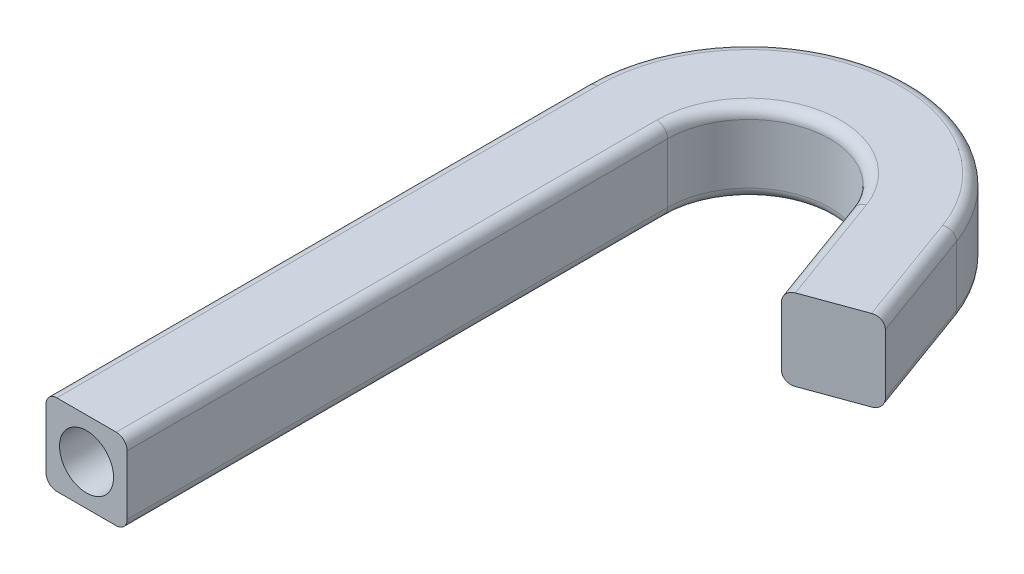
ISO-10303-21;
HEADER;
FILE_DESCRIPTION(('STEP AP214'),'2;1');
FILE_NAME('part.step','',(''),(''),'','','');
FILE_SCHEMA(('AUTOMOTIVE_DESIGN { 1 0 10303 214 1 1 1 1 }'));
ENDSEC;
DATA;
#1=APPLICATION_CONTEXT('core data for automotive mechanical design processes');
#2=APPLICATION_PROTOCOL_DEFINITION('international standard','automotive_design',2000,#1);
#3=PRODUCT_CONTEXT('',#1,'mechanical');
#4=PRODUCT('Part','Part','',(#3));
#5=PRODUCT_RELATED_PRODUCT_CATEGORY('part','',(#4));
#6=PRODUCT_DEFINITION_FORMATION('','',#4);
#7=PRODUCT_DEFINITION_CONTEXT('part definition',#1,'design');
#8=PRODUCT_DEFINITION('design','',#6,#7);
#9=PRODUCT_DEFINITION_SHAPE('','',#8);
#10=(LENGTH_UNIT() NAMED_UNIT(*) SI_UNIT(.MILLI.,.METRE.));
#11=(NAMED_UNIT(*) PLANE_ANGLE_UNIT() SI_UNIT($,.RADIAN.));
#12=(NAMED_UNIT(*) SI_UNIT($,.STERADIAN.) SOLID_ANGLE_UNIT());
#13=UNCERTAINTY_MEASURE_WITH_UNIT(LENGTH_MEASURE(1.E-05),#10,'distance_accuracy_value','');
#14=(GEOMETRIC_REPRESENTATION_CONTEXT(3) GLOBAL_UNCERTAINTY_ASSIGNED_CONTEXT((#13)) GLOBAL_UNIT_ASSIGNED_CONTEXT((#10,
#11,#12)) REPRESENTATION_CONTEXT('',''));
#15=CARTESIAN_POINT('',(0.,0.,0.));
#16=DIRECTION('',(0.,0.,1.));
#17=DIRECTION('',(1.,0.,0.));
#18=AXIS2_PLACEMENT_3D('',#15,#16,#17);
#19=CARTESIAN_POINT('',(17.9011444259716,19.05,-6.515483730354));
#20=DIRECTION('',(0.939692620785908,0.,-0.342020143325669));
#21=DIRECTION('',(-0.342020143325669,0.,-0.939692620785908));
#22=AXIS2_PLACEMENT_3D('',#19,#20,#21);
#23=PLANE('',#22);
#24=DIRECTION('',(0.,-1.,0.));
#25=VECTOR('',#24,1.);
#26=CARTESIAN_POINT('',(27.4622856022967,19.05,19.753535755817));
#27=LINE('',#26,#25);
#28=CARTESIAN_POINT('',(27.4622856022967,16.51,19.753535755817));
#29=VERTEX_POINT('',#28);
#30=CARTESIAN_POINT('',(27.4622856022967,2.54000000000001,19.753535755817));
#31=VERTEX_POINT('',#30);
#32=EDGE_CURVE('E208',#29,#31,#27,.T.);
#33=ORIENTED_EDGE('',*,*,#32,.F.);
#34=DIRECTION('',(0.342020143325669,0.,0.939692620785908));
#35=VECTOR('',#34,1.);
#36=CARTESIAN_POINT('',(17.9011444259716,16.51,-6.515483730354));
#37=LINE('',#36,#35);
#38=CARTESIAN_POINT('',(17.9011444259716,16.51,-6.515483730354));
#39=VERTEX_POINT('',#38);
#40=EDGE_CURVE('E152',#29,#39,#37,.F.);
#41=ORIENTED_EDGE('',*,*,#40,.T.);
#42=DIRECTION('',(0.,-1.,0.));
#43=VECTOR('',#42,1.);
#44=CARTESIAN_POINT('',(17.9011444259716,19.05,-6.515483730354));
#45=LINE('',#44,#43);
#46=CARTESIAN_POINT('',(17.9011444259716,2.54000000000001,-6.515483730354));
#47=VERTEX_POINT('',#46);
#48=EDGE_CURVE('E178',#39,#47,#45,.T.);
#49=ORIENTED_EDGE('',*,*,#48,.T.);
#50=DIRECTION('',(0.342020143325669,0.,0.939692620785908));
#51=VECTOR('',#50,1.);
#52=CARTESIAN_POINT('',(17.9011444259716,2.54,-6.515483730354));
#53=LINE('',#52,#51);
#54=EDGE_CURVE('E157',#47,#31,#53,.T.);
#55=ORIENTED_EDGE('',*,*,#54,.T.);
#56=EDGE_LOOP('',(#33,#41,#49,#55));
#57=FACE_BOUND('',#56,.T.);
#58=ADVANCED_FACE('F32',(#57),#23,.F.);
#59=CARTESIAN_POINT('',(27.4622856022967,19.05,19.753535755817));
#60=DIRECTION('',(-0.342020143325669,0.,-0.939692620785908));
#61=DIRECTION('',(-0.939692620785908,0.,0.342020143325669));
#62=AXIS2_PLACEMENT_3D('',#59,#60,#61);
#63=PLANE('',#62);
#64=DIRECTION('',(0.939692620785908,0.,-0.342020143325669));
#65=VECTOR('',#64,1.);
#66=CARTESIAN_POINT('',(27.4622856022967,19.05,19.753535755817));
#67=LINE('',#66,#65);
#68=CARTESIAN_POINT('',(29.8491048590929,19.05,18.8848045917698));
#69=VERTEX_POINT('',#68);
#70=CARTESIAN_POINT('',(42.976610771472,19.05,14.1067831895102));
#71=VERTEX_POINT('',#70);
#72=EDGE_CURVE('E164',#69,#71,#67,.T.);
#73=ORIENTED_EDGE('',*,*,#72,.F.);
#74=CARTESIAN_POINT('',(29.8491048590929,16.51,18.8848045917698));
#75=DIRECTION('',(-0.342020143325669,0.,-0.939692620785908));
#76=DIRECTION('',(-0.939692620785908,0.,0.342020143325669));
#77=AXIS2_PLACEMENT_3D('',#74,#75,#76);
#78=CIRCLE('',#77,2.54);
#79=EDGE_CURVE('E147',#69,#29,#78,.F.);
#80=ORIENTED_EDGE('',*,*,#79,.T.);
#81=ORIENTED_EDGE('',*,*,#32,.T.);
#82=CARTESIAN_POINT('',(29.8491048590929,2.54,18.8848045917698));
#83=DIRECTION('',(-0.342020143325669,0.,-0.939692620785908));
#84=DIRECTION('',(-0.939692620785908,0.,0.342020143325669));
#85=AXIS2_PLACEMENT_3D('',#82,#83,#84);
#86=CIRCLE('',#85,2.54);
#87=CARTESIAN_POINT('',(29.8491048590929,0.,18.8848045917698));
#88=VERTEX_POINT('',#87);
#89=EDGE_CURVE('E158',#31,#88,#86,.F.);
#90=ORIENTED_EDGE('',*,*,#89,.T.);
#91=DIRECTION('',(0.939692620785908,0.,-0.342020143325669));
#92=VECTOR('',#91,1.);
#93=CARTESIAN_POINT('',(27.4622856022967,0.,19.753535755817));
#94=LINE('',#93,#92);
#95=CARTESIAN_POINT('',(42.976610771472,0.,14.1067831895102));
#96=VERTEX_POINT('',#95);
#97=EDGE_CURVE('E181',#88,#96,#94,.T.);
#98=ORIENTED_EDGE('',*,*,#97,.T.);
#99=CARTESIAN_POINT('',(42.976610771472,2.54,14.1067831895102));
#100=DIRECTION('',(-0.342020143325669,0.,-0.939692620785908));
#101=DIRECTION('',(-0.939692620785908,0.,0.342020143325669));
#102=AXIS2_PLACEMENT_3D('',#99,#100,#101);
#103=CIRCLE('',#102,2.54);
#104=CARTESIAN_POINT('',(45.3634300282682,2.54000000000001,13.238052025463));
#105=VERTEX_POINT('',#104);
#106=EDGE_CURVE('E220',#96,#105,#103,.F.);
#107=ORIENTED_EDGE('',*,*,#106,.T.);
#108=DIRECTION('',(0.,-1.,0.));
#109=VECTOR('',#108,1.);
#110=CARTESIAN_POINT('',(45.3634300282682,19.05,13.238052025463));
#111=LINE('',#110,#109);
#112=CARTESIAN_POINT('',(45.3634300282682,16.51,13.238052025463));
#113=VERTEX_POINT('',#112);
#114=EDGE_CURVE('E206',#113,#105,#111,.T.);
#115=ORIENTED_EDGE('',*,*,#114,.F.);
#116=CARTESIAN_POINT('',(42.976610771472,16.51,14.1067831895102));
#117=DIRECTION('',(-0.342020143325669,0.,-0.939692620785908));
#118=DIRECTION('',(-0.939692620785908,0.,0.342020143325669));
#119=AXIS2_PLACEMENT_3D('',#116,#117,#118);
#120=CIRCLE('',#119,2.54);
#121=EDGE_CURVE('E169',#113,#71,#120,.F.);
#122=ORIENTED_EDGE('',*,*,#121,.T.);
#123=EDGE_LOOP('',(#73,#80,#81,#90,#98,#107,#115,#122));
#124=FACE_BOUND('',#123,.T.);
#125=ADVANCED_FACE('F171',(#124),#63,.F.);
#126=CARTESIAN_POINT('',(35.8022888519431,19.05,-13.030967460708));
#127=DIRECTION('',(-0.939692620785908,0.,0.342020143325669));
#128=DIRECTION('',(0.342020143325669,0.,0.939692620785908));
#129=AXIS2_PLACEMENT_3D('',#126,#127,#128);
#130=PLANE('',#129);
#131=ORIENTED_EDGE('',*,*,#114,.T.);
#132=DIRECTION('',(-0.342020143325669,0.,-0.939692620785908));
#133=VECTOR('',#132,1.);
#134=CARTESIAN_POINT('',(35.8022888519431,2.54,-13.030967460708));
#135=LINE('',#134,#133);
#136=CARTESIAN_POINT('',(35.8022888519431,2.54000000000001,-13.030967460708));
#137=VERTEX_POINT('',#136);
#138=EDGE_CURVE('E11',#105,#137,#135,.T.);
#139=ORIENTED_EDGE('',*,*,#138,.T.);
#140=DIRECTION('',(0.,-1.,0.));
#141=VECTOR('',#140,1.);
#142=CARTESIAN_POINT('',(35.8022888519431,19.05,-13.030967460708));
#143=LINE('',#142,#141);
#144=CARTESIAN_POINT('',(35.8022888519431,16.51,-13.030967460708));
#145=VERTEX_POINT('',#144);
#146=EDGE_CURVE('E204',#145,#137,#143,.T.);
#147=ORIENTED_EDGE('',*,*,#146,.F.);
#148=DIRECTION('',(-0.342020143325669,0.,-0.939692620785908));
#149=VECTOR('',#148,1.);
#150=CARTESIAN_POINT('',(45.3634300282682,16.51,13.238052025463));
#151=LINE('',#150,#149);
#152=EDGE_CURVE('E41',#145,#113,#151,.F.);
#153=ORIENTED_EDGE('',*,*,#152,.T.);
#154=EDGE_LOOP('',(#131,#139,#147,#153));
#155=FACE_BOUND('',#154,.T.);
#156=ADVANCED_FACE('F350',(#155),#130,.F.);
#157=CARTESIAN_POINT('',(0.,19.05,0.));
#158=DIRECTION('',(0.,-1.,0.));
#159=DIRECTION('',(0.,0.,-1.));
#160=AXIS2_PLACEMENT_3D('',#157,#158,#159);
#161=CYLINDRICAL_SURFACE('',#160,38.1);
#162=ORIENTED_EDGE('',*,*,#146,.T.);
#163=CARTESIAN_POINT('',(0.,2.54,0.));
#164=DIRECTION('',(0.,1.,0.));
#165=DIRECTION('',(0.,0.,1.));
#166=AXIS2_PLACEMENT_3D('',#163,#164,#165);
#167=CIRCLE('',#166,38.1);
#168=CARTESIAN_POINT('',(-38.1,2.54000000000001,0.));
#169=VERTEX_POINT('',#168);
#170=EDGE_CURVE('E260',#137,#169,#167,.T.);
#171=ORIENTED_EDGE('',*,*,#170,.T.);
#172=DIRECTION('',(0.,-1.,0.));
#173=VECTOR('',#172,1.);
#174=CARTESIAN_POINT('',(-38.1,19.05,0.));
#175=LINE('',#174,#173);
#176=CARTESIAN_POINT('',(-38.1,16.51,0.));
#177=VERTEX_POINT('',#176);
#178=EDGE_CURVE('E201',#177,#169,#175,.T.);
#179=ORIENTED_EDGE('',*,*,#178,.F.);
#180=CARTESIAN_POINT('',(0.,16.51,0.));
#181=DIRECTION('',(0.,1.,0.));
#182=DIRECTION('',(0.,0.,1.));
#183=AXIS2_PLACEMENT_3D('',#180,#181,#182);
#184=CIRCLE('',#183,38.1);
#185=EDGE_CURVE('E54',#177,#145,#184,.F.);
#186=ORIENTED_EDGE('',*,*,#185,.T.);
#187=EDGE_LOOP('',(#162,#171,#179,#186));
#188=FACE_BOUND('',#187,.T.);
#189=ADVANCED_FACE('F386',(#188),#161,.T.);
#190=CARTESIAN_POINT('',(-38.1,19.05,0.));
#191=DIRECTION('',(1.,0.,0.));
#192=DIRECTION('',(0.,0.,-1.));
#193=AXIS2_PLACEMENT_3D('',#190,#191,#192);
#194=PLANE('',#193);
#195=ORIENTED_EDGE('',*,*,#178,.T.);
#196=DIRECTION('',(0.,0.,1.));
#197=VECTOR('',#196,1.);
#198=CARTESIAN_POINT('',(-38.1,2.54,0.));
#199=LINE('',#198,#197);
#200=CARTESIAN_POINT('',(-38.1,2.54000000000001,127.));
#201=VERTEX_POINT('',#200);
#202=EDGE_CURVE('E256',#169,#201,#199,.T.);
#203=ORIENTED_EDGE('',*,*,#202,.T.);
#204=DIRECTION('',(0.,-1.,0.));
#205=VECTOR('',#204,1.);
#206=CARTESIAN_POINT('',(-38.1,19.05,127.));
#207=LINE('',#206,#205);
#208=CARTESIAN_POINT('',(-38.1,16.51,127.));
#209=VERTEX_POINT('',#208);
#210=EDGE_CURVE('E198',#209,#201,#207,.T.);
#211=ORIENTED_EDGE('',*,*,#210,.F.);
#212=DIRECTION('',(0.,0.,1.));
#213=VECTOR('',#212,1.);
#214=CARTESIAN_POINT('',(-38.1,16.51,0.));
#215=LINE('',#214,#213);
#216=EDGE_CURVE('E254',#209,#177,#215,.F.);
#217=ORIENTED_EDGE('',*,*,#216,.T.);
#218=EDGE_LOOP('',(#195,#203,#211,#217));
#219=FACE_BOUND('',#218,.T.);
#220=ADVANCED_FACE('F382',(#219),#194,.F.);
#221=CARTESIAN_POINT('',(-38.1,19.05,127.));
#222=DIRECTION('',(0.,0.,-1.));
#223=DIRECTION('',(-1.,0.,0.));
#224=AXIS2_PLACEMENT_3D('',#221,#222,#223);
#225=PLANE('',#224);
#226=CARTESIAN_POINT('',(-28.575,9.525,127.));
#227=DIRECTION('',(0.,0.,1.));
#228=DIRECTION('',(1.,0.,0.));
#229=AXIS2_PLACEMENT_3D('',#226,#227,#228);
#230=CIRCLE('',#229,6.35);
#231=CARTESIAN_POINT('',(-22.225,9.525,127.));
#232=VERTEX_POINT('',#231);
#233=EDGE_CURVE('E184',#232,#232,#230,.T.);
#234=ORIENTED_EDGE('',*,*,#233,.F.);
#235=EDGE_LOOP('',(#234));
#236=FACE_BOUND('',#235,.T.);
#237=DIRECTION('',(1.,0.,0.));
#238=VECTOR('',#237,1.);
#239=CARTESIAN_POINT('',(-38.1,0.,127.));
#240=LINE('',#239,#238);
#241=CARTESIAN_POINT('',(-35.56,0.,127.));
#242=VERTEX_POINT('',#241);
#243=CARTESIAN_POINT('',(-21.59,0.,127.));
#244=VERTEX_POINT('',#243);
#245=EDGE_CURVE('E175',#242,#244,#240,.T.);
#246=ORIENTED_EDGE('',*,*,#245,.T.);
#247=CARTESIAN_POINT('',(-21.59,2.54,127.));
#248=DIRECTION('',(0.,0.,-1.));
#249=DIRECTION('',(-1.,0.,0.));
#250=AXIS2_PLACEMENT_3D('',#247,#248,#249);
#251=CIRCLE('',#250,2.54);
#252=CARTESIAN_POINT('',(-19.05,2.54000000000001,127.));
#253=VERTEX_POINT('',#252);
#254=EDGE_CURVE('E252',#244,#253,#251,.F.);
#255=ORIENTED_EDGE('',*,*,#254,.T.);
#256=DIRECTION('',(0.,-1.,0.));
#257=VECTOR('',#256,1.);
#258=CARTESIAN_POINT('',(-19.05,19.05,127.));
#259=LINE('',#258,#257);
#260=CARTESIAN_POINT('',(-19.05,16.51,127.));
#261=VERTEX_POINT('',#260);
#262=EDGE_CURVE('E195',#261,#253,#259,.T.);
#263=ORIENTED_EDGE('',*,*,#262,.F.);
#264=CARTESIAN_POINT('',(-21.59,16.51,127.));
#265=DIRECTION('',(0.,0.,-1.));
#266=DIRECTION('',(-1.,0.,0.));
#267=AXIS2_PLACEMENT_3D('',#264,#265,#266);
#268=CIRCLE('',#267,2.54);
#269=CARTESIAN_POINT('',(-21.59,19.05,127.));
#270=VERTEX_POINT('',#269);
#271=EDGE_CURVE('E250',#261,#270,#268,.F.);
#272=ORIENTED_EDGE('',*,*,#271,.T.);
#273=DIRECTION('',(1.,0.,0.));
#274=VECTOR('',#273,1.);
#275=CARTESIAN_POINT('',(-38.1,19.05,127.));
#276=LINE('',#275,#274);
#277=CARTESIAN_POINT('',(-35.56,19.05,127.));
#278=VERTEX_POINT('',#277);
#279=EDGE_CURVE('E174',#278,#270,#276,.T.);
#280=ORIENTED_EDGE('',*,*,#279,.F.);
#281=CARTESIAN_POINT('',(-35.56,16.51,127.));
#282=DIRECTION('',(0.,0.,-1.));
#283=DIRECTION('',(-1.,0.,0.));
#284=AXIS2_PLACEMENT_3D('',#281,#282,#283);
#285=CIRCLE('',#284,2.54);
#286=EDGE_CURVE('E246',#278,#209,#285,.F.);
#287=ORIENTED_EDGE('',*,*,#286,.T.);
#288=ORIENTED_EDGE('',*,*,#210,.T.);
#289=CARTESIAN_POINT('',(-35.56,2.54,127.));
#290=DIRECTION('',(0.,0.,-1.));
#291=DIRECTION('',(-1.,0.,0.));
#292=AXIS2_PLACEMENT_3D('',#289,#290,#291);
#293=CIRCLE('',#292,2.54);
#294=EDGE_CURVE('E248',#201,#242,#293,.F.);
#295=ORIENTED_EDGE('',*,*,#294,.T.);
#296=EDGE_LOOP('',(#246,#255,#263,#272,#280,#287,#288,#295));
#297=FACE_BOUND('',#296,.T.);
#298=ADVANCED_FACE('F295',(#236,#297),#225,.F.);
#299=CARTESIAN_POINT('',(-19.05,19.05,0.));
#300=DIRECTION('',(-1.,0.,0.));
#301=DIRECTION('',(0.,0.,1.));
#302=AXIS2_PLACEMENT_3D('',#299,#300,#301);
#303=PLANE('',#302);
#304=ORIENTED_EDGE('',*,*,#262,.T.);
#305=DIRECTION('',(0.,0.,-1.));
#306=VECTOR('',#305,1.);
#307=CARTESIAN_POINT('',(-19.05,2.54,0.));
#308=LINE('',#307,#306);
#309=CARTESIAN_POINT('',(-19.05,2.54000000000001,0.));
#310=VERTEX_POINT('',#309);
#311=EDGE_CURVE('E244',#253,#310,#308,.T.);
#312=ORIENTED_EDGE('',*,*,#311,.T.);
#313=DIRECTION('',(0.,-1.,0.));
#314=VECTOR('',#313,1.);
#315=CARTESIAN_POINT('',(-19.05,19.05,0.));
#316=LINE('',#315,#314);
#317=CARTESIAN_POINT('',(-19.05,16.51,0.));
#318=VERTEX_POINT('',#317);
#319=EDGE_CURVE('E192',#318,#310,#316,.T.);
#320=ORIENTED_EDGE('',*,*,#319,.F.);
#321=DIRECTION('',(0.,0.,-1.));
#322=VECTOR('',#321,1.);
#323=CARTESIAN_POINT('',(-19.05,16.51,127.));
#324=LINE('',#323,#322);
#325=EDGE_CURVE('E242',#318,#261,#324,.F.);
#326=ORIENTED_EDGE('',*,*,#325,.T.);
#327=EDGE_LOOP('',(#304,#312,#320,#326));
#328=FACE_BOUND('',#327,.T.);
#329=ADVANCED_FACE('F312',(#328),#303,.F.);
#330=CARTESIAN_POINT('',(0.,19.05,0.));
#331=DIRECTION('',(0.,-1.,0.));
#332=DIRECTION('',(0.,0.,-1.));
#333=AXIS2_PLACEMENT_3D('',#330,#331,#332);
#334=CYLINDRICAL_SURFACE('',#333,19.05);
#335=ORIENTED_EDGE('',*,*,#48,.F.);
#336=CARTESIAN_POINT('',(0.,16.51,0.));
#337=DIRECTION('',(0.,1.,0.));
#338=DIRECTION('',(0.,0.,1.));
#339=AXIS2_PLACEMENT_3D('',#336,#337,#338);
#340=CIRCLE('',#339,19.05);
#341=EDGE_CURVE('E228',#39,#318,#340,.T.);
#342=ORIENTED_EDGE('',*,*,#341,.T.);
#343=ORIENTED_EDGE('',*,*,#319,.T.);
#344=CARTESIAN_POINT('',(0.,2.54,0.));
#345=DIRECTION('',(0.,1.,0.));
#346=DIRECTION('',(0.,0.,1.));
#347=AXIS2_PLACEMENT_3D('',#344,#345,#346);
#348=CIRCLE('',#347,19.05);
#349=EDGE_CURVE('E226',#310,#47,#348,.F.);
#350=ORIENTED_EDGE('',*,*,#349,.T.);
#351=EDGE_LOOP('',(#335,#342,#343,#350));
#352=FACE_BOUND('',#351,.T.);
#353=ADVANCED_FACE('F309',(#352),#334,.F.);
#354=CARTESIAN_POINT('',(0.,19.05,0.));
#355=DIRECTION('',(0.,1.,0.));
#356=DIRECTION('',(0.,0.,1.));
#357=AXIS2_PLACEMENT_3D('',#354,#355,#356);
#358=PLANE('',#357);
#359=CARTESIAN_POINT('',(0.,19.05,0.));
#360=DIRECTION('',(0.,1.,0.));
#361=DIRECTION('',(0.,0.,1.));
#362=AXIS2_PLACEMENT_3D('',#359,#360,#361);
#363=CIRCLE('',#362,21.59);
#364=CARTESIAN_POINT('',(-21.59,19.05,0.));
#365=VERTEX_POINT('',#364);
#366=CARTESIAN_POINT('',(20.2879636827678,19.05,-7.3842148944012));
#367=VERTEX_POINT('',#366);
#368=EDGE_CURVE('E167',#365,#367,#363,.F.);
#369=ORIENTED_EDGE('',*,*,#368,.T.);
#370=DIRECTION('',(0.342020143325669,0.,0.939692620785908));
#371=VECTOR('',#370,1.);
#372=CARTESIAN_POINT('',(29.8491048590929,19.05,18.8848045917699));
#373=LINE('',#372,#371);
#374=EDGE_CURVE('E151',#367,#69,#373,.T.);
#375=ORIENTED_EDGE('',*,*,#374,.T.);
#376=ORIENTED_EDGE('',*,*,#72,.T.);
#377=DIRECTION('',(-0.342020143325669,0.,-0.939692620785908));
#378=VECTOR('',#377,1.);
#379=CARTESIAN_POINT('',(33.4154695951469,19.05,-12.1622362966608));
#380=LINE('',#379,#378);
#381=CARTESIAN_POINT('',(33.4154695951469,19.05,-12.1622362966608));
#382=VERTEX_POINT('',#381);
#383=EDGE_CURVE('E214',#71,#382,#380,.T.);
#384=ORIENTED_EDGE('',*,*,#383,.T.);
#385=CARTESIAN_POINT('',(0.,19.05,0.));
#386=DIRECTION('',(0.,1.,0.));
#387=DIRECTION('',(0.,0.,1.));
#388=AXIS2_PLACEMENT_3D('',#385,#386,#387);
#389=CIRCLE('',#388,35.56);
#390=CARTESIAN_POINT('',(-35.56,19.05,0.));
#391=VERTEX_POINT('',#390);
#392=EDGE_CURVE('E212',#382,#391,#389,.T.);
#393=ORIENTED_EDGE('',*,*,#392,.T.);
#394=DIRECTION('',(0.,0.,1.));
#395=VECTOR('',#394,1.);
#396=CARTESIAN_POINT('',(-35.56,19.05,127.));
#397=LINE('',#396,#395);
#398=EDGE_CURVE('E210',#391,#278,#397,.T.);
#399=ORIENTED_EDGE('',*,*,#398,.T.);
#400=ORIENTED_EDGE('',*,*,#279,.T.);
#401=DIRECTION('',(0.,0.,-1.));
#402=VECTOR('',#401,1.);
#403=CARTESIAN_POINT('',(-21.59,19.05,0.));
#404=LINE('',#403,#402);
#405=EDGE_CURVE('E216',#270,#365,#404,.T.);
#406=ORIENTED_EDGE('',*,*,#405,.T.);
#407=EDGE_LOOP('',(#369,#375,#376,#384,#393,#399,#400,#406));
#408=FACE_BOUND('',#407,.T.);
#409=ADVANCED_FACE('F162',(#408),#358,.T.);
#410=CARTESIAN_POINT('',(0.,0.,0.));
#411=DIRECTION('',(0.,1.,0.));
#412=DIRECTION('',(0.,0.,1.));
#413=AXIS2_PLACEMENT_3D('',#410,#411,#412);
#414=PLANE('',#413);
#415=ORIENTED_EDGE('',*,*,#97,.F.);
#416=DIRECTION('',(0.342020143325669,0.,0.939692620785908));
#417=VECTOR('',#416,1.);
#418=CARTESIAN_POINT('',(20.2879636827678,0.,-7.3842148944012));
#419=LINE('',#418,#417);
#420=CARTESIAN_POINT('',(20.2879636827678,0.,-7.3842148944012));
#421=VERTEX_POINT('',#420);
#422=EDGE_CURVE('E240',#88,#421,#419,.F.);
#423=ORIENTED_EDGE('',*,*,#422,.T.);
#424=CARTESIAN_POINT('',(0.,0.,0.));
#425=DIRECTION('',(0.,1.,0.));
#426=DIRECTION('',(0.,0.,1.));
#427=AXIS2_PLACEMENT_3D('',#424,#425,#426);
#428=CIRCLE('',#427,21.59);
#429=CARTESIAN_POINT('',(-21.59,0.,0.));
#430=VERTEX_POINT('',#429);
#431=EDGE_CURVE('E238',#421,#430,#428,.T.);
#432=ORIENTED_EDGE('',*,*,#431,.T.);
#433=DIRECTION('',(0.,0.,-1.));
#434=VECTOR('',#433,1.);
#435=CARTESIAN_POINT('',(-21.59,0.,0.));
#436=LINE('',#435,#434);
#437=EDGE_CURVE('E236',#430,#244,#436,.F.);
#438=ORIENTED_EDGE('',*,*,#437,.T.);
#439=ORIENTED_EDGE('',*,*,#245,.F.);
#440=DIRECTION('',(0.,0.,1.));
#441=VECTOR('',#440,1.);
#442=CARTESIAN_POINT('',(-35.56,0.,0.));
#443=LINE('',#442,#441);
#444=CARTESIAN_POINT('',(-35.56,0.,0.));
#445=VERTEX_POINT('',#444);
#446=EDGE_CURVE('E234',#242,#445,#443,.F.);
#447=ORIENTED_EDGE('',*,*,#446,.T.);
#448=CARTESIAN_POINT('',(0.,0.,0.));
#449=DIRECTION('',(0.,1.,0.));
#450=DIRECTION('',(0.,0.,1.));
#451=AXIS2_PLACEMENT_3D('',#448,#449,#450);
#452=CIRCLE('',#451,35.56);
#453=CARTESIAN_POINT('',(33.4154695951469,0.,-12.1622362966608));
#454=VERTEX_POINT('',#453);
#455=EDGE_CURVE('E232',#445,#454,#452,.F.);
#456=ORIENTED_EDGE('',*,*,#455,.T.);
#457=DIRECTION('',(-0.342020143325669,0.,-0.939692620785908));
#458=VECTOR('',#457,1.);
#459=CARTESIAN_POINT('',(33.4154695951469,0.,-12.1622362966608));
#460=LINE('',#459,#458);
#461=EDGE_CURVE('E230',#454,#96,#460,.F.);
#462=ORIENTED_EDGE('',*,*,#461,.T.);
#463=EDGE_LOOP('',(#415,#423,#432,#438,#439,#447,#456,#462));
#464=FACE_BOUND('',#463,.T.);
#465=ADVANCED_FACE('F330',(#464),#414,.F.);
#466=CARTESIAN_POINT('',(-28.575,9.525,92.71));
#467=DIRECTION('',(0.,0.,1.));
#468=DIRECTION('',(1.,0.,0.));
#469=AXIS2_PLACEMENT_3D('',#466,#467,#468);
#470=CYLINDRICAL_SURFACE('',#469,6.35);
#471=CARTESIAN_POINT('',(-28.575,9.525,92.71));
#472=DIRECTION('',(0.,0.,1.));
#473=DIRECTION('',(1.,0.,0.));
#474=AXIS2_PLACEMENT_3D('',#471,#472,#473);
#475=CIRCLE('',#474,6.35);
#476=CARTESIAN_POINT('',(-22.225,9.525,92.71));
#477=VERTEX_POINT('',#476);
#478=EDGE_CURVE('E188',#477,#477,#475,.T.);
#479=ORIENTED_EDGE('',*,*,#478,.F.);
#480=EDGE_LOOP('',(#479));
#481=FACE_BOUND('',#480,.T.);
#482=ORIENTED_EDGE('',*,*,#233,.T.);
#483=EDGE_LOOP('',(#482));
#484=FACE_BOUND('',#483,.T.);
#485=ADVANCED_FACE('F362',(#481,#484),#470,.F.);
#486=CARTESIAN_POINT('',(-28.575,9.525,92.71));
#487=DIRECTION('',(0.,0.,1.));
#488=DIRECTION('',(1.,0.,0.));
#489=AXIS2_PLACEMENT_3D('',#486,#487,#488);
#490=PLANE('',#489);
#491=ORIENTED_EDGE('',*,*,#478,.T.);
#492=EDGE_LOOP('',(#491));
#493=FACE_BOUND('',#492,.T.);
#494=ADVANCED_FACE('F358',(#493),#490,.T.);
#495=CARTESIAN_POINT('',(-21.59,16.51,0.));
#496=DIRECTION('',(0.,0.,1.));
#497=DIRECTION('',(1.,0.,0.));
#498=AXIS2_PLACEMENT_3D('',#495,#496,#497);
#499=CYLINDRICAL_SURFACE('',#498,2.54);
#500=ORIENTED_EDGE('',*,*,#271,.F.);
#501=ORIENTED_EDGE('',*,*,#325,.F.);
#502=CARTESIAN_POINT('',(-21.59,16.51,0.));
#503=DIRECTION('',(0.,0.,-1.));
#504=DIRECTION('',(-1.,0.,0.));
#505=AXIS2_PLACEMENT_3D('',#502,#503,#504);
#506=CIRCLE('',#505,2.54);
#507=EDGE_CURVE('E265',#365,#318,#506,.T.);
#508=ORIENTED_EDGE('',*,*,#507,.F.);
#509=ORIENTED_EDGE('',*,*,#405,.F.);
#510=EDGE_LOOP('',(#500,#501,#508,#509));
#511=FACE_BOUND('',#510,.T.);
#512=ADVANCED_FACE('F301',(#511),#499,.T.);
#513=CARTESIAN_POINT('',(0.,16.51,0.));
#514=DIRECTION('',(0.,1.,0.));
#515=DIRECTION('',(0.,0.,1.));
#516=AXIS2_PLACEMENT_3D('',#513,#514,#515);
#517=TOROIDAL_SURFACE('',#516,21.59,2.54);
#518=ORIENTED_EDGE('',*,*,#507,.T.);
#519=ORIENTED_EDGE('',*,*,#341,.F.);
#520=CARTESIAN_POINT('',(20.2879636827678,16.51,-7.3842148944012));
#521=DIRECTION('',(0.342020143325669,0.,0.939692620785908));
#522=DIRECTION('',(0.939692620785908,0.,-0.342020143325669));
#523=AXIS2_PLACEMENT_3D('',#520,#521,#522);
#524=CIRCLE('',#523,2.54);
#525=EDGE_CURVE('E263',#367,#39,#524,.T.);
#526=ORIENTED_EDGE('',*,*,#525,.F.);
#527=ORIENTED_EDGE('',*,*,#368,.F.);
#528=EDGE_LOOP('',(#518,#519,#526,#527));
#529=FACE_BOUND('',#528,.T.);
#530=ADVANCED_FACE('F305',(#529),#517,.T.);
#531=CARTESIAN_POINT('',(20.2879636827678,16.51,-7.3842148944012));
#532=DIRECTION('',(-0.342020143325669,0.,-0.939692620785908));
#533=DIRECTION('',(-0.939692620785908,0.,0.342020143325669));
#534=AXIS2_PLACEMENT_3D('',#531,#532,#533);
#535=CYLINDRICAL_SURFACE('',#534,2.54);
#536=ORIENTED_EDGE('',*,*,#525,.T.);
#537=ORIENTED_EDGE('',*,*,#40,.F.);
#538=ORIENTED_EDGE('',*,*,#79,.F.);
#539=ORIENTED_EDGE('',*,*,#374,.F.);
#540=EDGE_LOOP('',(#536,#537,#538,#539));
#541=FACE_BOUND('',#540,.T.);
#542=ADVANCED_FACE('F150',(#541),#535,.T.);
#543=CARTESIAN_POINT('',(-21.59,2.54,0.));
#544=DIRECTION('',(0.,0.,-1.));
#545=DIRECTION('',(-1.,0.,0.));
#546=AXIS2_PLACEMENT_3D('',#543,#544,#545);
#547=CYLINDRICAL_SURFACE('',#546,2.54);
#548=ORIENTED_EDGE('',*,*,#254,.F.);
#549=ORIENTED_EDGE('',*,*,#437,.F.);
#550=CARTESIAN_POINT('',(-21.59,2.54,0.));
#551=DIRECTION('',(0.,0.,-1.));
#552=DIRECTION('',(-1.,0.,0.));
#553=AXIS2_PLACEMENT_3D('',#550,#551,#552);
#554=CIRCLE('',#553,2.54);
#555=EDGE_CURVE('E266',#310,#430,#554,.T.);
#556=ORIENTED_EDGE('',*,*,#555,.F.);
#557=ORIENTED_EDGE('',*,*,#311,.F.);
#558=EDGE_LOOP('',(#548,#549,#556,#557));
#559=FACE_BOUND('',#558,.T.);
#560=ADVANCED_FACE('F316',(#559),#547,.T.);
#561=CARTESIAN_POINT('',(0.,2.54,0.));
#562=DIRECTION('',(0.,1.,0.));
#563=DIRECTION('',(0.,0.,1.));
#564=AXIS2_PLACEMENT_3D('',#561,#562,#563);
#565=TOROIDAL_SURFACE('',#564,21.59,2.54);
#566=ORIENTED_EDGE('',*,*,#555,.T.);
#567=ORIENTED_EDGE('',*,*,#431,.F.);
#568=CARTESIAN_POINT('',(20.2879636827678,2.54,-7.3842148944012));
#569=DIRECTION('',(0.342020143325669,0.,0.939692620785908));
#570=DIRECTION('',(0.939692620785908,0.,-0.342020143325669));
#571=AXIS2_PLACEMENT_3D('',#568,#569,#570);
#572=CIRCLE('',#571,2.54);
#573=EDGE_CURVE('E269',#47,#421,#572,.T.);
#574=ORIENTED_EDGE('',*,*,#573,.F.);
#575=ORIENTED_EDGE('',*,*,#349,.F.);
#576=EDGE_LOOP('',(#566,#567,#574,#575));
#577=FACE_BOUND('',#576,.T.);
#578=ADVANCED_FACE('F322',(#577),#565,.T.);
#579=CARTESIAN_POINT('',(20.2879636827678,2.54,-7.3842148944012));
#580=DIRECTION('',(0.342020143325669,0.,0.939692620785908));
#581=DIRECTION('',(0.939692620785908,0.,-0.342020143325669));
#582=AXIS2_PLACEMENT_3D('',#579,#580,#581);
#583=CYLINDRICAL_SURFACE('',#582,2.54);
#584=ORIENTED_EDGE('',*,*,#573,.T.);
#585=ORIENTED_EDGE('',*,*,#422,.F.);
#586=ORIENTED_EDGE('',*,*,#89,.F.);
#587=ORIENTED_EDGE('',*,*,#54,.F.);
#588=EDGE_LOOP('',(#584,#585,#586,#587));
#589=FACE_BOUND('',#588,.T.);
#590=ADVANCED_FACE('F332',(#589),#583,.T.);
#591=CARTESIAN_POINT('',(33.4154695951469,2.54,-12.1622362966608));
#592=DIRECTION('',(-0.342020143325669,0.,-0.939692620785908));
#593=DIRECTION('',(-0.939692620785908,0.,0.342020143325669));
#594=AXIS2_PLACEMENT_3D('',#591,#592,#593);
#595=CYLINDRICAL_SURFACE('',#594,2.54);
#596=ORIENTED_EDGE('',*,*,#106,.F.);
#597=ORIENTED_EDGE('',*,*,#461,.F.);
#598=CARTESIAN_POINT('',(33.4154695951469,2.54,-12.1622362966608));
#599=DIRECTION('',(-0.342020143325669,0.,-0.939692620785908));
#600=DIRECTION('',(-0.939692620785908,0.,0.342020143325669));
#601=AXIS2_PLACEMENT_3D('',#598,#599,#600);
#602=CIRCLE('',#601,2.54);
#603=EDGE_CURVE('E272',#137,#454,#602,.T.);
#604=ORIENTED_EDGE('',*,*,#603,.F.);
#605=ORIENTED_EDGE('',*,*,#138,.F.);
#606=EDGE_LOOP('',(#596,#597,#604,#605));
#607=FACE_BOUND('',#606,.T.);
#608=ADVANCED_FACE('F334',(#607),#595,.T.);
#609=CARTESIAN_POINT('',(0.,2.54,0.));
#610=DIRECTION('',(0.,1.,0.));
#611=DIRECTION('',(0.,0.,1.));
#612=AXIS2_PLACEMENT_3D('',#609,#610,#611);
#613=TOROIDAL_SURFACE('',#612,35.56,2.54);
#614=ORIENTED_EDGE('',*,*,#603,.T.);
#615=ORIENTED_EDGE('',*,*,#455,.F.);
#616=CARTESIAN_POINT('',(-35.56,2.54,0.));
#617=DIRECTION('',(0.,0.,1.));
#618=DIRECTION('',(0.,-1.,0.));
#619=AXIS2_PLACEMENT_3D('',#616,#617,#618);
#620=CIRCLE('',#619,2.54);
#621=EDGE_CURVE('E275',#169,#445,#620,.T.);
#622=ORIENTED_EDGE('',*,*,#621,.F.);
#623=ORIENTED_EDGE('',*,*,#170,.F.);
#624=EDGE_LOOP('',(#614,#615,#622,#623));
#625=FACE_BOUND('',#624,.T.);
#626=ADVANCED_FACE('F340',(#625),#613,.T.);
#627=CARTESIAN_POINT('',(-35.56,2.54,0.));
#628=DIRECTION('',(0.,0.,1.));
#629=DIRECTION('',(1.,0.,0.));
#630=AXIS2_PLACEMENT_3D('',#627,#628,#629);
#631=CYLINDRICAL_SURFACE('',#630,2.54);
#632=ORIENTED_EDGE('',*,*,#621,.T.);
#633=ORIENTED_EDGE('',*,*,#446,.F.);
#634=ORIENTED_EDGE('',*,*,#294,.F.);
#635=ORIENTED_EDGE('',*,*,#202,.F.);
#636=EDGE_LOOP('',(#632,#633,#634,#635));
#637=FACE_BOUND('',#636,.T.);
#638=ADVANCED_FACE('F401',(#637),#631,.T.);
#639=CARTESIAN_POINT('',(-35.56,16.51,0.));
#640=DIRECTION('',(0.,0.,-1.));
#641=DIRECTION('',(-1.,0.,0.));
#642=AXIS2_PLACEMENT_3D('',#639,#640,#641);
#643=CYLINDRICAL_SURFACE('',#642,2.54);
#644=ORIENTED_EDGE('',*,*,#286,.F.);
#645=ORIENTED_EDGE('',*,*,#398,.F.);
#646=CARTESIAN_POINT('',(-35.56,16.51,0.));
#647=DIRECTION('',(0.,0.,-1.));
#648=DIRECTION('',(0.,1.,0.));
#649=AXIS2_PLACEMENT_3D('',#646,#647,#648);
#650=CIRCLE('',#649,2.54);
#651=EDGE_CURVE('E36',#177,#391,#650,.T.);
#652=ORIENTED_EDGE('',*,*,#651,.F.);
#653=ORIENTED_EDGE('',*,*,#216,.F.);
#654=EDGE_LOOP('',(#644,#645,#652,#653));
#655=FACE_BOUND('',#654,.T.);
#656=ADVANCED_FACE('F34',(#655),#643,.T.);
#657=CARTESIAN_POINT('',(0.,16.51,0.));
#658=DIRECTION('',(0.,1.,0.));
#659=DIRECTION('',(0.,0.,1.));
#660=AXIS2_PLACEMENT_3D('',#657,#658,#659);
#661=TOROIDAL_SURFACE('',#660,35.56,2.54);
#662=ORIENTED_EDGE('',*,*,#651,.T.);
#663=ORIENTED_EDGE('',*,*,#392,.F.);
#664=CARTESIAN_POINT('',(33.4154695951469,16.51,-12.1622362966608));
#665=DIRECTION('',(0.342020143325669,0.,0.939692620785908));
#666=DIRECTION('',(0.939692620785908,0.,-0.342020143325669));
#667=AXIS2_PLACEMENT_3D('',#664,#665,#666);
#668=CIRCLE('',#667,2.54);
#669=EDGE_CURVE('E279',#145,#382,#668,.T.);
#670=ORIENTED_EDGE('',*,*,#669,.F.);
#671=ORIENTED_EDGE('',*,*,#185,.F.);
#672=EDGE_LOOP('',(#662,#663,#670,#671));
#673=FACE_BOUND('',#672,.T.);
#674=ADVANCED_FACE('F287',(#673),#661,.T.);
#675=CARTESIAN_POINT('',(33.4154695951469,16.51,-12.1622362966608));
#676=DIRECTION('',(0.342020143325669,0.,0.939692620785908));
#677=DIRECTION('',(0.939692620785908,0.,-0.342020143325669));
#678=AXIS2_PLACEMENT_3D('',#675,#676,#677);
#679=CYLINDRICAL_SURFACE('',#678,2.54);
#680=ORIENTED_EDGE('',*,*,#121,.F.);
#681=ORIENTED_EDGE('',*,*,#152,.F.);
#682=ORIENTED_EDGE('',*,*,#669,.T.);
#683=ORIENTED_EDGE('',*,*,#383,.F.);
#684=EDGE_LOOP('',(#680,#681,#682,#683));
#685=FACE_BOUND('',#684,.T.);
#686=ADVANCED_FACE('F411',(#685),#679,.T.);
#687=CLOSED_SHELL('',(#58,#125,#156,#189,#220,#298,#329,#353,#409,#465,#485,#494,#512,#530,#542,
#560,#578,#590,#608,#626,#638,#656,#674,#686));
#688=MANIFOLD_SOLID_BREP('B2',#687);
#689=ADVANCED_BREP_SHAPE_REPRESENTATION('',(#18,#688),#14);
#690=SHAPE_DEFINITION_REPRESENTATION(#9,#689);
ENDSEC;
END-ISO-10303-21;
